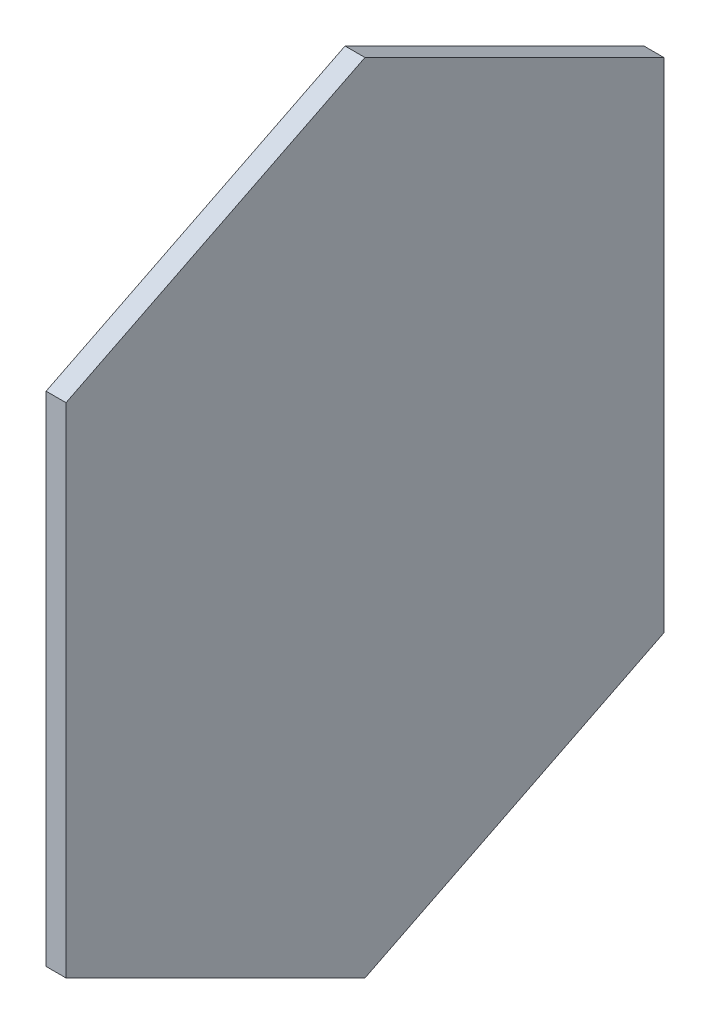
ISO-10303-21;
HEADER;
FILE_DESCRIPTION(('STEP AP214'),'2;1');
FILE_NAME('part.step','',(''),(''),'','','');
FILE_SCHEMA(('AUTOMOTIVE_DESIGN { 1 0 10303 214 1 1 1 1 }'));
ENDSEC;
DATA;
#1=APPLICATION_CONTEXT('core data for automotive mechanical design processes');
#2=APPLICATION_PROTOCOL_DEFINITION('international standard','automotive_design',2000,#1);
#3=PRODUCT_CONTEXT('',#1,'mechanical');
#4=PRODUCT('Part','Part','',(#3));
#5=PRODUCT_RELATED_PRODUCT_CATEGORY('part','',(#4));
#6=PRODUCT_DEFINITION_FORMATION('','',#4);
#7=PRODUCT_DEFINITION_CONTEXT('part definition',#1,'design');
#8=PRODUCT_DEFINITION('design','',#6,#7);
#9=PRODUCT_DEFINITION_SHAPE('','',#8);
#10=(LENGTH_UNIT() NAMED_UNIT(*) SI_UNIT(.MILLI.,.METRE.));
#11=(NAMED_UNIT(*) PLANE_ANGLE_UNIT() SI_UNIT($,.RADIAN.));
#12=(NAMED_UNIT(*) SI_UNIT($,.STERADIAN.) SOLID_ANGLE_UNIT());
#13=UNCERTAINTY_MEASURE_WITH_UNIT(LENGTH_MEASURE(1.E-05),#10,'distance_accuracy_value','');
#14=(GEOMETRIC_REPRESENTATION_CONTEXT(3) GLOBAL_UNCERTAINTY_ASSIGNED_CONTEXT((#13)) GLOBAL_UNIT_ASSIGNED_CONTEXT((#10,
#11,#12)) REPRESENTATION_CONTEXT('',''));
#15=CARTESIAN_POINT('',(0.,0.,0.));
#16=DIRECTION('',(0.,0.,1.));
#17=DIRECTION('',(1.,0.,0.));
#18=AXIS2_PLACEMENT_3D('',#15,#16,#17);
#19=CARTESIAN_POINT('',(25.4,317.5,-381.));
#20=DIRECTION('',(0.,-0.894427190999916,0.447213595499958));
#21=DIRECTION('',(0.,-0.447213595499958,-0.894427190999916));
#22=AXIS2_PLACEMENT_3D('',#19,#20,#21);
#23=PLANE('',#22);
#24=DIRECTION('',(0.,0.447213595499958,0.894427190999916));
#25=VECTOR('',#24,1.);
#26=CARTESIAN_POINT('',(0.,317.5,-381.));
#27=LINE('',#26,#25);
#28=CARTESIAN_POINT('',(0.,317.5,-381.));
#29=VERTEX_POINT('',#28);
#30=CARTESIAN_POINT('',(0.,508.,0.));
#31=VERTEX_POINT('',#30);
#32=EDGE_CURVE('E120',#29,#31,#27,.T.);
#33=ORIENTED_EDGE('',*,*,#32,.T.);
#34=DIRECTION('',(-1.,0.,0.));
#35=VECTOR('',#34,1.);
#36=CARTESIAN_POINT('',(25.4,508.,0.));
#37=LINE('',#36,#35);
#38=CARTESIAN_POINT('',(25.4,508.,0.));
#39=VERTEX_POINT('',#38);
#40=EDGE_CURVE('E11',#39,#31,#37,.T.);
#41=ORIENTED_EDGE('',*,*,#40,.F.);
#42=DIRECTION('',(0.,0.447213595499958,0.894427190999916));
#43=VECTOR('',#42,1.);
#44=CARTESIAN_POINT('',(25.4,317.5,-381.));
#45=LINE('',#44,#43);
#46=CARTESIAN_POINT('',(25.4,317.5,-381.));
#47=VERTEX_POINT('',#46);
#48=EDGE_CURVE('E132',#47,#39,#45,.T.);
#49=ORIENTED_EDGE('',*,*,#48,.F.);
#50=DIRECTION('',(-1.,0.,0.));
#51=VECTOR('',#50,1.);
#52=CARTESIAN_POINT('',(25.4,317.5,-381.));
#53=LINE('',#52,#51);
#54=EDGE_CURVE('E51',#47,#29,#53,.T.);
#55=ORIENTED_EDGE('',*,*,#54,.T.);
#56=EDGE_LOOP('',(#33,#41,#49,#55));
#57=FACE_BOUND('',#56,.T.);
#58=ADVANCED_FACE('F35',(#57),#23,.F.);
#59=CARTESIAN_POINT('',(25.4,508.,0.));
#60=DIRECTION('',(0.,-0.894427190999916,-0.447213595499958));
#61=DIRECTION('',(0.,0.447213595499958,-0.894427190999916));
#62=AXIS2_PLACEMENT_3D('',#59,#60,#61);
#63=PLANE('',#62);
#64=DIRECTION('',(0.,-0.447213595499958,0.894427190999916));
#65=VECTOR('',#64,1.);
#66=CARTESIAN_POINT('',(0.,508.,0.));
#67=LINE('',#66,#65);
#68=CARTESIAN_POINT('',(0.,317.5,381.));
#69=VERTEX_POINT('',#68);
#70=EDGE_CURVE('E122',#31,#69,#67,.T.);
#71=ORIENTED_EDGE('',*,*,#70,.T.);
#72=DIRECTION('',(-1.,0.,0.));
#73=VECTOR('',#72,1.);
#74=CARTESIAN_POINT('',(25.4,317.5,381.));
#75=LINE('',#74,#73);
#76=CARTESIAN_POINT('',(25.4,317.5,381.));
#77=VERTEX_POINT('',#76);
#78=EDGE_CURVE('E43',#77,#69,#75,.T.);
#79=ORIENTED_EDGE('',*,*,#78,.F.);
#80=DIRECTION('',(0.,-0.447213595499958,0.894427190999916));
#81=VECTOR('',#80,1.);
#82=CARTESIAN_POINT('',(25.4,508.,0.));
#83=LINE('',#82,#81);
#84=EDGE_CURVE('E84',#39,#77,#83,.T.);
#85=ORIENTED_EDGE('',*,*,#84,.F.);
#86=ORIENTED_EDGE('',*,*,#40,.T.);
#87=EDGE_LOOP('',(#71,#79,#85,#86));
#88=FACE_BOUND('',#87,.T.);
#89=ADVANCED_FACE('F152',(#88),#63,.F.);
#90=CARTESIAN_POINT('',(25.4,317.5,381.));
#91=DIRECTION('',(0.,0.,-1.));
#92=DIRECTION('',(-1.,0.,0.));
#93=AXIS2_PLACEMENT_3D('',#90,#91,#92);
#94=PLANE('',#93);
#95=DIRECTION('',(0.,-1.,0.));
#96=VECTOR('',#95,1.);
#97=CARTESIAN_POINT('',(0.,317.5,381.));
#98=LINE('',#97,#96);
#99=CARTESIAN_POINT('',(0.,-317.5,381.));
#100=VERTEX_POINT('',#99);
#101=EDGE_CURVE('E124',#69,#100,#98,.T.);
#102=ORIENTED_EDGE('',*,*,#101,.T.);
#103=DIRECTION('',(-1.,0.,0.));
#104=VECTOR('',#103,1.);
#105=CARTESIAN_POINT('',(25.4,-317.5,381.));
#106=LINE('',#105,#104);
#107=CARTESIAN_POINT('',(25.4,-317.5,381.));
#108=VERTEX_POINT('',#107);
#109=EDGE_CURVE('E112',#108,#100,#106,.T.);
#110=ORIENTED_EDGE('',*,*,#109,.F.);
#111=DIRECTION('',(0.,-1.,0.));
#112=VECTOR('',#111,1.);
#113=CARTESIAN_POINT('',(25.4,317.5,381.));
#114=LINE('',#113,#112);
#115=EDGE_CURVE('E100',#77,#108,#114,.T.);
#116=ORIENTED_EDGE('',*,*,#115,.F.);
#117=ORIENTED_EDGE('',*,*,#78,.T.);
#118=EDGE_LOOP('',(#102,#110,#116,#117));
#119=FACE_BOUND('',#118,.T.);
#120=ADVANCED_FACE('F138',(#119),#94,.F.);
#121=CARTESIAN_POINT('',(25.4,-317.5,381.));
#122=DIRECTION('',(0.,0.894427190999916,-0.447213595499958));
#123=DIRECTION('',(0.,0.447213595499958,0.894427190999916));
#124=AXIS2_PLACEMENT_3D('',#121,#122,#123);
#125=PLANE('',#124);
#126=DIRECTION('',(0.,-0.447213595499958,-0.894427190999916));
#127=VECTOR('',#126,1.);
#128=CARTESIAN_POINT('',(0.,-317.5,381.));
#129=LINE('',#128,#127);
#130=CARTESIAN_POINT('',(0.,-508.,0.));
#131=VERTEX_POINT('',#130);
#132=EDGE_CURVE('E109',#100,#131,#129,.T.);
#133=ORIENTED_EDGE('',*,*,#132,.T.);
#134=DIRECTION('',(-1.,0.,0.));
#135=VECTOR('',#134,1.);
#136=CARTESIAN_POINT('',(25.4,-508.,0.));
#137=LINE('',#136,#135);
#138=CARTESIAN_POINT('',(25.4,-508.,0.));
#139=VERTEX_POINT('',#138);
#140=EDGE_CURVE('E106',#139,#131,#137,.T.);
#141=ORIENTED_EDGE('',*,*,#140,.F.);
#142=DIRECTION('',(0.,-0.447213595499958,-0.894427190999916));
#143=VECTOR('',#142,1.);
#144=CARTESIAN_POINT('',(25.4,-317.5,381.));
#145=LINE('',#144,#143);
#146=EDGE_CURVE('E93',#108,#139,#145,.T.);
#147=ORIENTED_EDGE('',*,*,#146,.F.);
#148=ORIENTED_EDGE('',*,*,#109,.T.);
#149=EDGE_LOOP('',(#133,#141,#147,#148));
#150=FACE_BOUND('',#149,.T.);
#151=ADVANCED_FACE('F107',(#150),#125,.F.);
#152=CARTESIAN_POINT('',(25.4,-508.,0.));
#153=DIRECTION('',(0.,0.894427190999916,0.447213595499958));
#154=DIRECTION('',(0.,-0.447213595499958,0.894427190999916));
#155=AXIS2_PLACEMENT_3D('',#152,#153,#154);
#156=PLANE('',#155);
#157=DIRECTION('',(0.,0.447213595499958,-0.894427190999916));
#158=VECTOR('',#157,1.);
#159=CARTESIAN_POINT('',(0.,-508.,0.));
#160=LINE('',#159,#158);
#161=CARTESIAN_POINT('',(0.,-317.5,-381.));
#162=VERTEX_POINT('',#161);
#163=EDGE_CURVE('E127',#131,#162,#160,.T.);
#164=ORIENTED_EDGE('',*,*,#163,.T.);
#165=DIRECTION('',(-1.,0.,0.));
#166=VECTOR('',#165,1.);
#167=CARTESIAN_POINT('',(25.4,-317.5,-381.));
#168=LINE('',#167,#166);
#169=CARTESIAN_POINT('',(25.4,-317.5,-381.));
#170=VERTEX_POINT('',#169);
#171=EDGE_CURVE('E72',#170,#162,#168,.T.);
#172=ORIENTED_EDGE('',*,*,#171,.F.);
#173=DIRECTION('',(0.,0.447213595499958,-0.894427190999916));
#174=VECTOR('',#173,1.);
#175=CARTESIAN_POINT('',(25.4,-508.,0.));
#176=LINE('',#175,#174);
#177=EDGE_CURVE('E98',#139,#170,#176,.T.);
#178=ORIENTED_EDGE('',*,*,#177,.F.);
#179=ORIENTED_EDGE('',*,*,#140,.T.);
#180=EDGE_LOOP('',(#164,#172,#178,#179));
#181=FACE_BOUND('',#180,.T.);
#182=ADVANCED_FACE('F114',(#181),#156,.F.);
#183=CARTESIAN_POINT('',(25.4,317.5,-381.));
#184=DIRECTION('',(0.,0.,-1.));
#185=DIRECTION('',(0.,1.,0.));
#186=AXIS2_PLACEMENT_3D('',#183,#184,#185);
#187=PLANE('',#186);
#188=DIRECTION('',(0.,-1.,0.));
#189=VECTOR('',#188,1.);
#190=CARTESIAN_POINT('',(0.,317.5,-381.));
#191=LINE('',#190,#189);
#192=EDGE_CURVE('E129',#29,#162,#191,.T.);
#193=ORIENTED_EDGE('',*,*,#192,.F.);
#194=ORIENTED_EDGE('',*,*,#54,.F.);
#195=DIRECTION('',(0.,-1.,0.));
#196=VECTOR('',#195,1.);
#197=CARTESIAN_POINT('',(25.4,317.5,-381.));
#198=LINE('',#197,#196);
#199=EDGE_CURVE('E115',#47,#170,#198,.T.);
#200=ORIENTED_EDGE('',*,*,#199,.T.);
#201=ORIENTED_EDGE('',*,*,#171,.T.);
#202=EDGE_LOOP('',(#193,#194,#200,#201));
#203=FACE_BOUND('',#202,.T.);
#204=ADVANCED_FACE('F141',(#203),#187,.T.);
#205=CARTESIAN_POINT('',(25.4,0.,0.));
#206=DIRECTION('',(1.,0.,0.));
#207=DIRECTION('',(0.,0.,-1.));
#208=AXIS2_PLACEMENT_3D('',#205,#206,#207);
#209=PLANE('',#208);
#210=ORIENTED_EDGE('',*,*,#48,.T.);
#211=ORIENTED_EDGE('',*,*,#84,.T.);
#212=ORIENTED_EDGE('',*,*,#115,.T.);
#213=ORIENTED_EDGE('',*,*,#146,.T.);
#214=ORIENTED_EDGE('',*,*,#177,.T.);
#215=ORIENTED_EDGE('',*,*,#199,.F.);
#216=EDGE_LOOP('',(#210,#211,#212,#213,#214,#215));
#217=FACE_BOUND('',#216,.T.);
#218=ADVANCED_FACE('F95',(#217),#209,.T.);
#219=CARTESIAN_POINT('',(0.,0.,0.));
#220=DIRECTION('',(1.,0.,0.));
#221=DIRECTION('',(0.,0.,-1.));
#222=AXIS2_PLACEMENT_3D('',#219,#220,#221);
#223=PLANE('',#222);
#224=ORIENTED_EDGE('',*,*,#32,.F.);
#225=ORIENTED_EDGE('',*,*,#192,.T.);
#226=ORIENTED_EDGE('',*,*,#163,.F.);
#227=ORIENTED_EDGE('',*,*,#132,.F.);
#228=ORIENTED_EDGE('',*,*,#101,.F.);
#229=ORIENTED_EDGE('',*,*,#70,.F.);
#230=EDGE_LOOP('',(#224,#225,#226,#227,#228,#229));
#231=FACE_BOUND('',#230,.T.);
#232=ADVANCED_FACE('F140',(#231),#223,.F.);
#233=CLOSED_SHELL('',(#58,#89,#120,#151,#182,#204,#218,#232));
#234=MANIFOLD_SOLID_BREP('B2',#233);
#235=ADVANCED_BREP_SHAPE_REPRESENTATION('',(#18,#234),#14);
#236=SHAPE_DEFINITION_REPRESENTATION(#9,#235);
ENDSEC;
END-ISO-10303-21;
